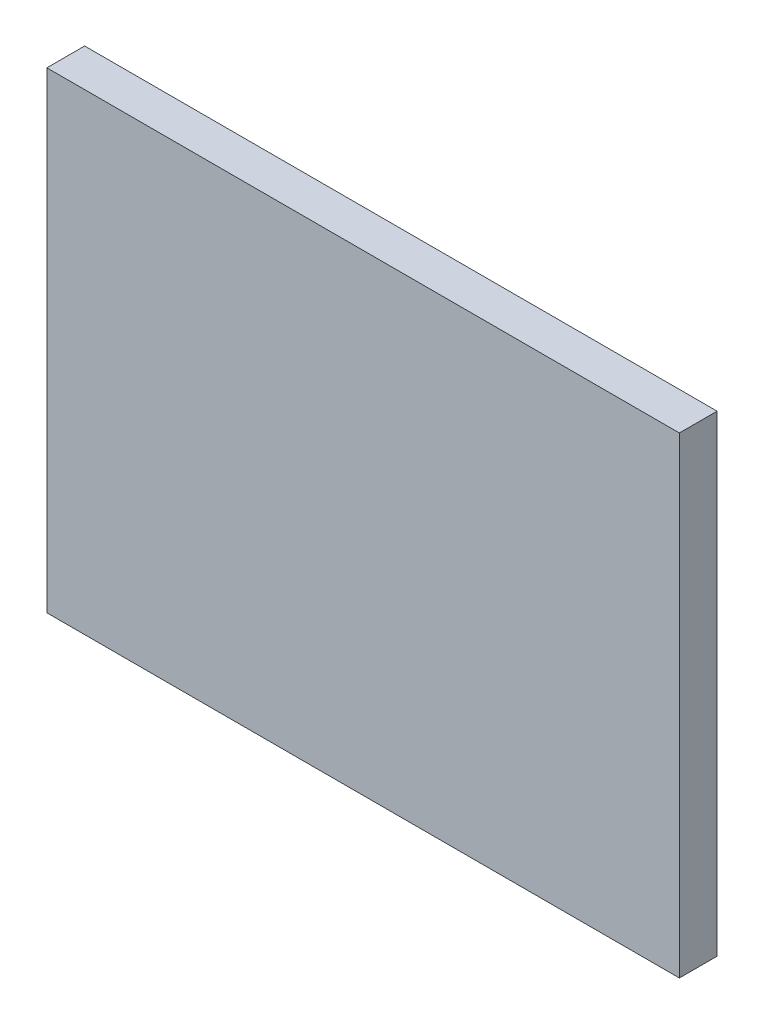
ISO-10303-21;
HEADER;
FILE_DESCRIPTION(('STEP AP214'),'2;1');
FILE_NAME('part.step','',(''),(''),'','','');
FILE_SCHEMA(('AUTOMOTIVE_DESIGN { 1 0 10303 214 1 1 1 1 }'));
ENDSEC;
DATA;
#1=APPLICATION_CONTEXT('core data for automotive mechanical design processes');
#2=APPLICATION_PROTOCOL_DEFINITION('international standard','automotive_design',2000,#1);
#3=PRODUCT_CONTEXT('',#1,'mechanical');
#4=PRODUCT('Part','Part','',(#3));
#5=PRODUCT_RELATED_PRODUCT_CATEGORY('part','',(#4));
#6=PRODUCT_DEFINITION_FORMATION('','',#4);
#7=PRODUCT_DEFINITION_CONTEXT('part definition',#1,'design');
#8=PRODUCT_DEFINITION('design','',#6,#7);
#9=PRODUCT_DEFINITION_SHAPE('','',#8);
#10=(LENGTH_UNIT() NAMED_UNIT(*) SI_UNIT(.MILLI.,.METRE.));
#11=(NAMED_UNIT(*) PLANE_ANGLE_UNIT() SI_UNIT($,.RADIAN.));
#12=(NAMED_UNIT(*) SI_UNIT($,.STERADIAN.) SOLID_ANGLE_UNIT());
#13=UNCERTAINTY_MEASURE_WITH_UNIT(LENGTH_MEASURE(1.E-05),#10,'distance_accuracy_value','');
#14=(GEOMETRIC_REPRESENTATION_CONTEXT(3) GLOBAL_UNCERTAINTY_ASSIGNED_CONTEXT((#13)) GLOBAL_UNIT_ASSIGNED_CONTEXT((#10,
#11,#12)) REPRESENTATION_CONTEXT('',''));
#15=CARTESIAN_POINT('',(0.,0.,0.));
#16=DIRECTION('',(0.,0.,1.));
#17=DIRECTION('',(1.,0.,0.));
#18=AXIS2_PLACEMENT_3D('',#15,#16,#17);
#19=CARTESIAN_POINT('',(-4978.4,1377.95,-12.7));
#20=DIRECTION('',(0.,1.,0.));
#21=DIRECTION('',(0.,0.,1.));
#22=AXIS2_PLACEMENT_3D('',#19,#20,#21);
#23=PLANE('',#22);
#24=DIRECTION('',(-1.,0.,0.));
#25=VECTOR('',#24,1.);
#26=CARTESIAN_POINT('',(-4978.4,1377.95,0.));
#27=LINE('',#26,#25);
#28=CARTESIAN_POINT('',(-4765.675,1377.95,0.));
#29=VERTEX_POINT('',#28);
#30=CARTESIAN_POINT('',(-4978.4,1377.95,0.));
#31=VERTEX_POINT('',#30);
#32=EDGE_CURVE('E95',#29,#31,#27,.T.);
#33=ORIENTED_EDGE('',*,*,#32,.F.);
#34=DIRECTION('',(0.,0.,1.));
#35=VECTOR('',#34,1.);
#36=CARTESIAN_POINT('',(-4765.675,1377.95,-12.7));
#37=LINE('',#36,#35);
#38=CARTESIAN_POINT('',(-4765.675,1377.95,-12.7));
#39=VERTEX_POINT('',#38);
#40=EDGE_CURVE('E11',#39,#29,#37,.T.);
#41=ORIENTED_EDGE('',*,*,#40,.F.);
#42=DIRECTION('',(-1.,0.,0.));
#43=VECTOR('',#42,1.);
#44=CARTESIAN_POINT('',(-4978.4,1377.95,-12.7));
#45=LINE('',#44,#43);
#46=CARTESIAN_POINT('',(-4978.4,1377.95,-12.7));
#47=VERTEX_POINT('',#46);
#48=EDGE_CURVE('E89',#39,#47,#45,.T.);
#49=ORIENTED_EDGE('',*,*,#48,.T.);
#50=DIRECTION('',(0.,0.,1.));
#51=VECTOR('',#50,1.);
#52=CARTESIAN_POINT('',(-4978.4,1377.95,-12.7));
#53=LINE('',#52,#51);
#54=EDGE_CURVE('E34',#47,#31,#53,.T.);
#55=ORIENTED_EDGE('',*,*,#54,.T.);
#56=EDGE_LOOP('',(#33,#41,#49,#55));
#57=FACE_BOUND('',#56,.T.);
#58=ADVANCED_FACE('F31',(#57),#23,.T.);
#59=CARTESIAN_POINT('',(-4765.675,1377.95,-12.7));
#60=DIRECTION('',(1.,0.,0.));
#61=DIRECTION('',(0.,0.,-1.));
#62=AXIS2_PLACEMENT_3D('',#59,#60,#61);
#63=PLANE('',#62);
#64=DIRECTION('',(0.,1.,0.));
#65=VECTOR('',#64,1.);
#66=CARTESIAN_POINT('',(-4765.675,1377.95,0.));
#67=LINE('',#66,#65);
#68=CARTESIAN_POINT('',(-4765.675,1219.2,0.));
#69=VERTEX_POINT('',#68);
#70=EDGE_CURVE('E91',#69,#29,#67,.T.);
#71=ORIENTED_EDGE('',*,*,#70,.F.);
#72=DIRECTION('',(0.,0.,1.));
#73=VECTOR('',#72,1.);
#74=CARTESIAN_POINT('',(-4765.675,1219.2,-12.7));
#75=LINE('',#74,#73);
#76=CARTESIAN_POINT('',(-4765.675,1219.2,-12.7));
#77=VERTEX_POINT('',#76);
#78=EDGE_CURVE('E40',#77,#69,#75,.T.);
#79=ORIENTED_EDGE('',*,*,#78,.F.);
#80=DIRECTION('',(0.,1.,0.));
#81=VECTOR('',#80,1.);
#82=CARTESIAN_POINT('',(-4765.675,1377.95,-12.7));
#83=LINE('',#82,#81);
#84=EDGE_CURVE('E86',#77,#39,#83,.T.);
#85=ORIENTED_EDGE('',*,*,#84,.T.);
#86=ORIENTED_EDGE('',*,*,#40,.T.);
#87=EDGE_LOOP('',(#71,#79,#85,#86));
#88=FACE_BOUND('',#87,.T.);
#89=ADVANCED_FACE('F105',(#88),#63,.T.);
#90=CARTESIAN_POINT('',(-4765.675,1219.2,-12.7));
#91=DIRECTION('',(0.,-1.,0.));
#92=DIRECTION('',(0.,0.,-1.));
#93=AXIS2_PLACEMENT_3D('',#90,#91,#92);
#94=PLANE('',#93);
#95=DIRECTION('',(1.,0.,0.));
#96=VECTOR('',#95,1.);
#97=CARTESIAN_POINT('',(-4765.675,1219.2,0.));
#98=LINE('',#97,#96);
#99=CARTESIAN_POINT('',(-4978.4,1219.2,0.));
#100=VERTEX_POINT('',#99);
#101=EDGE_CURVE('E81',#100,#69,#98,.T.);
#102=ORIENTED_EDGE('',*,*,#101,.F.);
#103=DIRECTION('',(0.,0.,1.));
#104=VECTOR('',#103,1.);
#105=CARTESIAN_POINT('',(-4978.4,1219.2,-12.7));
#106=LINE('',#105,#104);
#107=CARTESIAN_POINT('',(-4978.4,1219.2,-12.7));
#108=VERTEX_POINT('',#107);
#109=EDGE_CURVE('E76',#108,#100,#106,.T.);
#110=ORIENTED_EDGE('',*,*,#109,.F.);
#111=DIRECTION('',(1.,0.,0.));
#112=VECTOR('',#111,1.);
#113=CARTESIAN_POINT('',(-4765.675,1219.2,-12.7));
#114=LINE('',#113,#112);
#115=EDGE_CURVE('E79',#108,#77,#114,.T.);
#116=ORIENTED_EDGE('',*,*,#115,.T.);
#117=ORIENTED_EDGE('',*,*,#78,.T.);
#118=EDGE_LOOP('',(#102,#110,#116,#117));
#119=FACE_BOUND('',#118,.T.);
#120=ADVANCED_FACE('F78',(#119),#94,.T.);
#121=CARTESIAN_POINT('',(-4978.4,1219.2,-12.7));
#122=DIRECTION('',(-1.,0.,0.));
#123=DIRECTION('',(0.,0.,1.));
#124=AXIS2_PLACEMENT_3D('',#121,#122,#123);
#125=PLANE('',#124);
#126=DIRECTION('',(0.,-1.,0.));
#127=VECTOR('',#126,1.);
#128=CARTESIAN_POINT('',(-4978.4,1219.2,0.));
#129=LINE('',#128,#127);
#130=EDGE_CURVE('E98',#31,#100,#129,.T.);
#131=ORIENTED_EDGE('',*,*,#130,.F.);
#132=ORIENTED_EDGE('',*,*,#54,.F.);
#133=DIRECTION('',(0.,-1.,0.));
#134=VECTOR('',#133,1.);
#135=CARTESIAN_POINT('',(-4978.4,1219.2,-12.7));
#136=LINE('',#135,#134);
#137=EDGE_CURVE('E85',#47,#108,#136,.T.);
#138=ORIENTED_EDGE('',*,*,#137,.T.);
#139=ORIENTED_EDGE('',*,*,#109,.T.);
#140=EDGE_LOOP('',(#131,#132,#138,#139));
#141=FACE_BOUND('',#140,.T.);
#142=ADVANCED_FACE('F88',(#141),#125,.T.);
#143=CARTESIAN_POINT('',(-4765.675,1377.95,-12.7));
#144=DIRECTION('',(0.,0.,-1.));
#145=DIRECTION('',(-1.,0.,0.));
#146=AXIS2_PLACEMENT_3D('',#143,#144,#145);
#147=PLANE('',#146);
#148=ORIENTED_EDGE('',*,*,#48,.F.);
#149=ORIENTED_EDGE('',*,*,#84,.F.);
#150=ORIENTED_EDGE('',*,*,#115,.F.);
#151=ORIENTED_EDGE('',*,*,#137,.F.);
#152=EDGE_LOOP('',(#148,#149,#150,#151));
#153=FACE_BOUND('',#152,.T.);
#154=ADVANCED_FACE('F84',(#153),#147,.T.);
#155=CARTESIAN_POINT('',(-4765.675,1377.95,0.));
#156=DIRECTION('',(0.,0.,-1.));
#157=DIRECTION('',(-1.,0.,0.));
#158=AXIS2_PLACEMENT_3D('',#155,#156,#157);
#159=PLANE('',#158);
#160=ORIENTED_EDGE('',*,*,#32,.T.);
#161=ORIENTED_EDGE('',*,*,#130,.T.);
#162=ORIENTED_EDGE('',*,*,#101,.T.);
#163=ORIENTED_EDGE('',*,*,#70,.T.);
#164=EDGE_LOOP('',(#160,#161,#162,#163));
#165=FACE_BOUND('',#164,.T.);
#166=ADVANCED_FACE('F104',(#165),#159,.F.);
#167=CLOSED_SHELL('',(#58,#89,#120,#142,#154,#166));
#168=MANIFOLD_SOLID_BREP('B2',#167);
#169=ADVANCED_BREP_SHAPE_REPRESENTATION('',(#18,#168),#14);
#170=SHAPE_DEFINITION_REPRESENTATION(#9,#169);
ENDSEC;
END-ISO-10303-21;
